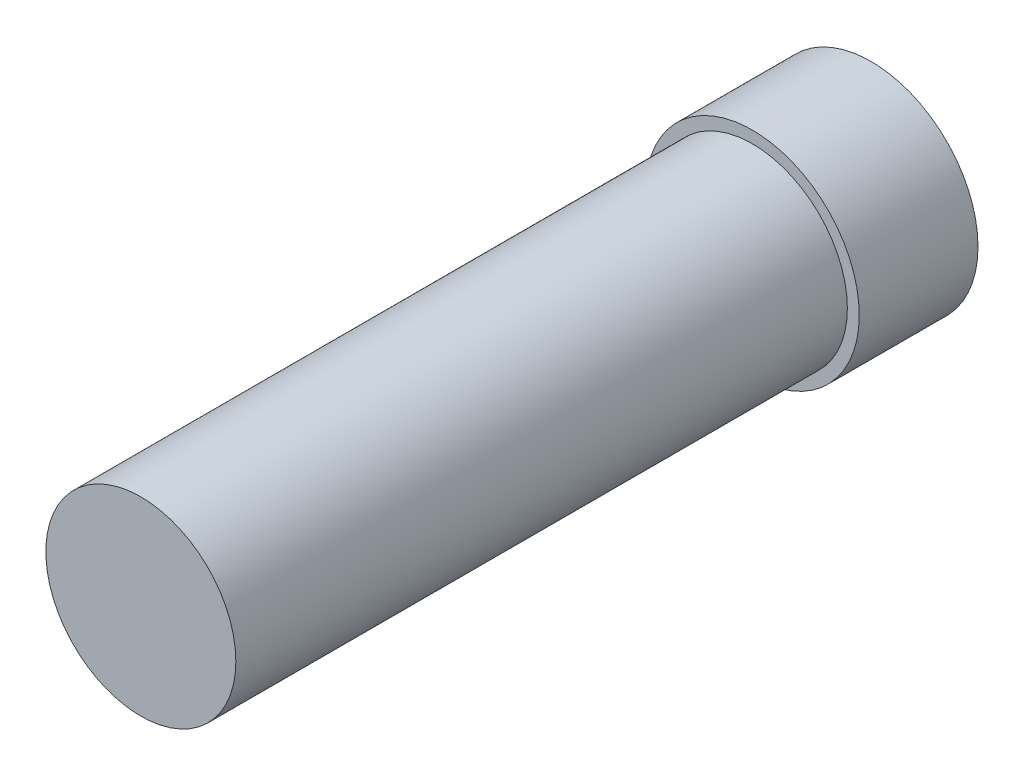
ISO-10303-21;
HEADER;
FILE_DESCRIPTION(('STEP AP214'),'2;1');
FILE_NAME('part.step','',(''),(''),'','','');
FILE_SCHEMA(('AUTOMOTIVE_DESIGN { 1 0 10303 214 1 1 1 1 }'));
ENDSEC;
DATA;
#1=APPLICATION_CONTEXT('core data for automotive mechanical design processes');
#2=APPLICATION_PROTOCOL_DEFINITION('international standard','automotive_design',2000,#1);
#3=PRODUCT_CONTEXT('',#1,'mechanical');
#4=PRODUCT('Part','Part','',(#3));
#5=PRODUCT_RELATED_PRODUCT_CATEGORY('part','',(#4));
#6=PRODUCT_DEFINITION_FORMATION('','',#4);
#7=PRODUCT_DEFINITION_CONTEXT('part definition',#1,'design');
#8=PRODUCT_DEFINITION('design','',#6,#7);
#9=PRODUCT_DEFINITION_SHAPE('','',#8);
#10=(LENGTH_UNIT() NAMED_UNIT(*) SI_UNIT(.MILLI.,.METRE.));
#11=(NAMED_UNIT(*) PLANE_ANGLE_UNIT() SI_UNIT($,.RADIAN.));
#12=(NAMED_UNIT(*) SI_UNIT($,.STERADIAN.) SOLID_ANGLE_UNIT());
#13=UNCERTAINTY_MEASURE_WITH_UNIT(LENGTH_MEASURE(1.E-05),#10,'distance_accuracy_value','');
#14=(GEOMETRIC_REPRESENTATION_CONTEXT(3) GLOBAL_UNCERTAINTY_ASSIGNED_CONTEXT((#13)) GLOBAL_UNIT_ASSIGNED_CONTEXT((#10,
#11,#12)) REPRESENTATION_CONTEXT('',''));
#15=CARTESIAN_POINT('',(0.,0.,0.));
#16=DIRECTION('',(0.,0.,1.));
#17=DIRECTION('',(1.,0.,0.));
#18=AXIS2_PLACEMENT_3D('',#15,#16,#17);
#19=CARTESIAN_POINT('',(0.,0.,13.08));
#20=DIRECTION('',(0.,0.,-1.));
#21=DIRECTION('',(-1.,0.,0.));
#22=AXIS2_PLACEMENT_3D('',#19,#20,#21);
#23=CYLINDRICAL_SURFACE('',#22,2.032);
#24=CARTESIAN_POINT('',(0.,0.,13.08));
#25=DIRECTION('',(0.,0.,1.));
#26=DIRECTION('',(1.,0.,0.));
#27=AXIS2_PLACEMENT_3D('',#24,#25,#26);
#28=CIRCLE('',#27,2.032);
#29=CARTESIAN_POINT('',(2.032,0.,13.08));
#30=VERTEX_POINT('',#29);
#31=EDGE_CURVE('E11',#30,#30,#28,.T.);
#32=ORIENTED_EDGE('',*,*,#31,.F.);
#33=EDGE_LOOP('',(#32));
#34=FACE_BOUND('',#33,.T.);
#35=CARTESIAN_POINT('',(0.,0.,0.));
#36=DIRECTION('',(0.,0.,1.));
#37=DIRECTION('',(1.,0.,0.));
#38=AXIS2_PLACEMENT_3D('',#35,#36,#37);
#39=CIRCLE('',#38,2.032);
#40=CARTESIAN_POINT('',(2.032,0.,0.));
#41=VERTEX_POINT('',#40);
#42=EDGE_CURVE('E38',#41,#41,#39,.T.);
#43=ORIENTED_EDGE('',*,*,#42,.T.);
#44=EDGE_LOOP('',(#43));
#45=FACE_BOUND('',#44,.T.);
#46=ADVANCED_FACE('F35',(#34,#45),#23,.T.);
#47=CARTESIAN_POINT('',(0.,0.,13.08));
#48=DIRECTION('',(0.,0.,1.));
#49=DIRECTION('',(1.,0.,0.));
#50=AXIS2_PLACEMENT_3D('',#47,#48,#49);
#51=PLANE('',#50);
#52=ORIENTED_EDGE('',*,*,#31,.T.);
#53=EDGE_LOOP('',(#52));
#54=FACE_BOUND('',#53,.T.);
#55=ADVANCED_FACE('F167',(#54),#51,.T.);
#56=CARTESIAN_POINT('',(0.,0.,-2.54));
#57=DIRECTION('',(0.,0.,1.));
#58=DIRECTION('',(1.,0.,0.));
#59=AXIS2_PLACEMENT_3D('',#56,#57,#58);
#60=CYLINDRICAL_SURFACE('',#59,2.286);
#61=CARTESIAN_POINT('',(0.,0.,-2.54));
#62=DIRECTION('',(0.,0.,-1.));
#63=DIRECTION('',(-1.,0.,0.));
#64=AXIS2_PLACEMENT_3D('',#61,#62,#63);
#65=CIRCLE('',#64,2.286);
#66=CARTESIAN_POINT('',(-2.286,0.,-2.54));
#67=VERTEX_POINT('',#66);
#68=EDGE_CURVE('E142',#67,#67,#65,.T.);
#69=ORIENTED_EDGE('',*,*,#68,.F.);
#70=EDGE_LOOP('',(#69));
#71=FACE_BOUND('',#70,.T.);
#72=CARTESIAN_POINT('',(0.,0.,0.));
#73=DIRECTION('',(0.,0.,-1.));
#74=DIRECTION('',(-1.,0.,0.));
#75=AXIS2_PLACEMENT_3D('',#72,#73,#74);
#76=CIRCLE('',#75,2.286);
#77=CARTESIAN_POINT('',(-2.286,0.,0.));
#78=VERTEX_POINT('',#77);
#79=EDGE_CURVE('E136',#78,#78,#76,.T.);
#80=ORIENTED_EDGE('',*,*,#79,.T.);
#81=EDGE_LOOP('',(#80));
#82=FACE_BOUND('',#81,.T.);
#83=ADVANCED_FACE('F148',(#71,#82),#60,.T.);
#84=CARTESIAN_POINT('',(0.,0.,-2.54));
#85=DIRECTION('',(0.,0.,-1.));
#86=DIRECTION('',(-1.,0.,0.));
#87=AXIS2_PLACEMENT_3D('',#84,#85,#86);
#88=PLANE('',#87);
#89=DIRECTION('',(-0.866025403784442,-0.499999999999995,0.));
#90=VECTOR('',#89,1.);
#91=CARTESIAN_POINT('',(1.34644615190706,-0.777371048252901,-2.54));
#92=LINE('',#91,#90);
#93=CARTESIAN_POINT('',(1.34644615190706,-0.777371048252901,-2.54));
#94=VERTEX_POINT('',#93);
#95=CARTESIAN_POINT('',(0.,-1.55474209650577,-2.54));
#96=VERTEX_POINT('',#95);
#97=EDGE_CURVE('E49',#94,#96,#92,.T.);
#98=ORIENTED_EDGE('',*,*,#97,.F.);
#99=DIRECTION('',(0.,-1.,0.));
#100=VECTOR('',#99,1.);
#101=CARTESIAN_POINT('',(1.34644615190708,0.777371048252872,-2.54));
#102=LINE('',#101,#100);
#103=CARTESIAN_POINT('',(1.34644615190708,0.777371048252872,-2.54));
#104=VERTEX_POINT('',#103);
#105=EDGE_CURVE('E132',#104,#94,#102,.T.);
#106=ORIENTED_EDGE('',*,*,#105,.F.);
#107=DIRECTION('',(0.866025403784435,-0.500000000000007,0.));
#108=VECTOR('',#107,1.);
#109=CARTESIAN_POINT('',(0.,1.55474209650577,-2.54));
#110=LINE('',#109,#108);
#111=CARTESIAN_POINT('',(0.,1.55474209650577,-2.54));
#112=VERTEX_POINT('',#111);
#113=EDGE_CURVE('E130',#112,#104,#110,.T.);
#114=ORIENTED_EDGE('',*,*,#113,.F.);
#115=DIRECTION('',(0.866025403784441,0.499999999999995,0.));
#116=VECTOR('',#115,1.);
#117=CARTESIAN_POINT('',(-1.34644615190707,0.777371048252891,-2.54));
#118=LINE('',#117,#116);
#119=CARTESIAN_POINT('',(-1.34644615190707,0.777371048252891,-2.54));
#120=VERTEX_POINT('',#119);
#121=EDGE_CURVE('E97',#120,#112,#118,.T.);
#122=ORIENTED_EDGE('',*,*,#121,.F.);
#123=DIRECTION('',(0.,1.,0.));
#124=VECTOR('',#123,1.);
#125=CARTESIAN_POINT('',(-1.34644615190708,-0.777371048252882,-2.54));
#126=LINE('',#125,#124);
#127=CARTESIAN_POINT('',(-1.34644615190708,-0.777371048252882,-2.54));
#128=VERTEX_POINT('',#127);
#129=EDGE_CURVE('E126',#128,#120,#126,.T.);
#130=ORIENTED_EDGE('',*,*,#129,.F.);
#131=DIRECTION('',(-0.866025403784438,0.500000000000001,0.));
#132=VECTOR('',#131,1.);
#133=CARTESIAN_POINT('',(0.,-1.55474209650577,-2.54));
#134=LINE('',#133,#132);
#135=EDGE_CURVE('E123',#96,#128,#134,.T.);
#136=ORIENTED_EDGE('',*,*,#135,.F.);
#137=EDGE_LOOP('',(#98,#106,#114,#122,#130,#136));
#138=FACE_BOUND('',#137,.T.);
#139=ORIENTED_EDGE('',*,*,#68,.T.);
#140=EDGE_LOOP('',(#139));
#141=FACE_BOUND('',#140,.T.);
#142=ADVANCED_FACE('F153',(#138,#141),#88,.T.);
#143=CARTESIAN_POINT('',(0.,0.,0.));
#144=DIRECTION('',(0.,0.,-1.));
#145=DIRECTION('',(-1.,0.,0.));
#146=AXIS2_PLACEMENT_3D('',#143,#144,#145);
#147=PLANE('',#146);
#148=ORIENTED_EDGE('',*,*,#42,.F.);
#149=EDGE_LOOP('',(#148));
#150=FACE_BOUND('',#149,.T.);
#151=ORIENTED_EDGE('',*,*,#79,.F.);
#152=EDGE_LOOP('',(#151));
#153=FACE_BOUND('',#152,.T.);
#154=ADVANCED_FACE('F150',(#150,#153),#147,.F.);
#155=CARTESIAN_POINT('',(1.34644615190706,-0.777371048252901,-0.508));
#156=DIRECTION('',(0.499999999999995,-0.866025403784442,0.));
#157=DIRECTION('',(0.866025403784442,0.499999999999995,0.));
#158=AXIS2_PLACEMENT_3D('',#155,#156,#157);
#159=PLANE('',#158);
#160=ORIENTED_EDGE('',*,*,#97,.T.);
#161=DIRECTION('',(0.,0.,-1.));
#162=VECTOR('',#161,1.);
#163=CARTESIAN_POINT('',(0.,-1.55474209650577,-0.508));
#164=LINE('',#163,#162);
#165=CARTESIAN_POINT('',(0.,-1.55474209650577,-0.508));
#166=VERTEX_POINT('',#165);
#167=EDGE_CURVE('E79',#166,#96,#164,.T.);
#168=ORIENTED_EDGE('',*,*,#167,.F.);
#169=DIRECTION('',(-0.866025403784442,-0.499999999999995,0.));
#170=VECTOR('',#169,1.);
#171=CARTESIAN_POINT('',(1.34644615190706,-0.777371048252901,-0.508));
#172=LINE('',#171,#170);
#173=CARTESIAN_POINT('',(1.34644615190706,-0.777371048252901,-0.508));
#174=VERTEX_POINT('',#173);
#175=EDGE_CURVE('E134',#174,#166,#172,.T.);
#176=ORIENTED_EDGE('',*,*,#175,.F.);
#177=DIRECTION('',(0.,0.,-1.));
#178=VECTOR('',#177,1.);
#179=CARTESIAN_POINT('',(1.34644615190706,-0.777371048252901,-0.508));
#180=LINE('',#179,#178);
#181=EDGE_CURVE('E57',#174,#94,#180,.T.);
#182=ORIENTED_EDGE('',*,*,#181,.T.);
#183=EDGE_LOOP('',(#160,#168,#176,#182));
#184=FACE_BOUND('',#183,.T.);
#185=ADVANCED_FACE('F152',(#184),#159,.F.);
#186=CARTESIAN_POINT('',(1.34644615190708,0.777371048252872,-0.508));
#187=DIRECTION('',(1.,0.,0.));
#188=DIRECTION('',(0.,1.,0.));
#189=AXIS2_PLACEMENT_3D('',#186,#187,#188);
#190=PLANE('',#189);
#191=ORIENTED_EDGE('',*,*,#105,.T.);
#192=ORIENTED_EDGE('',*,*,#181,.F.);
#193=DIRECTION('',(0.,-1.,0.));
#194=VECTOR('',#193,1.);
#195=CARTESIAN_POINT('',(1.34644615190708,0.777371048252872,-0.508));
#196=LINE('',#195,#194);
#197=CARTESIAN_POINT('',(1.34644615190708,0.777371048252872,-0.508));
#198=VERTEX_POINT('',#197);
#199=EDGE_CURVE('E109',#198,#174,#196,.T.);
#200=ORIENTED_EDGE('',*,*,#199,.F.);
#201=DIRECTION('',(0.,0.,-1.));
#202=VECTOR('',#201,1.);
#203=CARTESIAN_POINT('',(1.34644615190708,0.777371048252872,-0.508));
#204=LINE('',#203,#202);
#205=EDGE_CURVE('E101',#198,#104,#204,.T.);
#206=ORIENTED_EDGE('',*,*,#205,.T.);
#207=EDGE_LOOP('',(#191,#192,#200,#206));
#208=FACE_BOUND('',#207,.T.);
#209=ADVANCED_FACE('F160',(#208),#190,.F.);
#210=CARTESIAN_POINT('',(0.,1.55474209650577,-0.508));
#211=DIRECTION('',(0.500000000000007,0.866025403784435,0.));
#212=DIRECTION('',(-0.866025403784435,0.500000000000007,0.));
#213=AXIS2_PLACEMENT_3D('',#210,#211,#212);
#214=PLANE('',#213);
#215=ORIENTED_EDGE('',*,*,#113,.T.);
#216=ORIENTED_EDGE('',*,*,#205,.F.);
#217=DIRECTION('',(0.866025403784435,-0.500000000000007,0.));
#218=VECTOR('',#217,1.);
#219=CARTESIAN_POINT('',(0.,1.55474209650577,-0.508));
#220=LINE('',#219,#218);
#221=CARTESIAN_POINT('',(0.,1.55474209650577,-0.508));
#222=VERTEX_POINT('',#221);
#223=EDGE_CURVE('E105',#222,#198,#220,.T.);
#224=ORIENTED_EDGE('',*,*,#223,.F.);
#225=DIRECTION('',(0.,0.,-1.));
#226=VECTOR('',#225,1.);
#227=CARTESIAN_POINT('',(0.,1.55474209650577,-0.508));
#228=LINE('',#227,#226);
#229=EDGE_CURVE('E90',#222,#112,#228,.T.);
#230=ORIENTED_EDGE('',*,*,#229,.T.);
#231=EDGE_LOOP('',(#215,#216,#224,#230));
#232=FACE_BOUND('',#231,.T.);
#233=ADVANCED_FACE('F106',(#232),#214,.F.);
#234=CARTESIAN_POINT('',(-1.34644615190707,0.777371048252891,-0.508));
#235=DIRECTION('',(-0.499999999999995,0.866025403784441,0.));
#236=DIRECTION('',(-0.866025403784442,-0.499999999999995,0.));
#237=AXIS2_PLACEMENT_3D('',#234,#235,#236);
#238=PLANE('',#237);
#239=ORIENTED_EDGE('',*,*,#121,.T.);
#240=ORIENTED_EDGE('',*,*,#229,.F.);
#241=DIRECTION('',(0.866025403784441,0.499999999999995,0.));
#242=VECTOR('',#241,1.);
#243=CARTESIAN_POINT('',(-1.34644615190707,0.777371048252891,-0.508));
#244=LINE('',#243,#242);
#245=CARTESIAN_POINT('',(-1.34644615190707,0.777371048252891,-0.508));
#246=VERTEX_POINT('',#245);
#247=EDGE_CURVE('E94',#246,#222,#244,.T.);
#248=ORIENTED_EDGE('',*,*,#247,.F.);
#249=DIRECTION('',(0.,0.,-1.));
#250=VECTOR('',#249,1.);
#251=CARTESIAN_POINT('',(-1.34644615190707,0.777371048252891,-0.508));
#252=LINE('',#251,#250);
#253=EDGE_CURVE('E102',#246,#120,#252,.T.);
#254=ORIENTED_EDGE('',*,*,#253,.T.);
#255=EDGE_LOOP('',(#239,#240,#248,#254));
#256=FACE_BOUND('',#255,.T.);
#257=ADVANCED_FACE('F92',(#256),#238,.F.);
#258=CARTESIAN_POINT('',(-1.34644615190708,-0.777371048252882,-0.508));
#259=DIRECTION('',(-1.,0.,0.));
#260=DIRECTION('',(0.,-1.,0.));
#261=AXIS2_PLACEMENT_3D('',#258,#259,#260);
#262=PLANE('',#261);
#263=ORIENTED_EDGE('',*,*,#129,.T.);
#264=ORIENTED_EDGE('',*,*,#253,.F.);
#265=DIRECTION('',(0.,1.,0.));
#266=VECTOR('',#265,1.);
#267=CARTESIAN_POINT('',(-1.34644615190708,-0.777371048252882,-0.508));
#268=LINE('',#267,#266);
#269=CARTESIAN_POINT('',(-1.34644615190708,-0.777371048252882,-0.508));
#270=VERTEX_POINT('',#269);
#271=EDGE_CURVE('E115',#270,#246,#268,.T.);
#272=ORIENTED_EDGE('',*,*,#271,.F.);
#273=DIRECTION('',(0.,0.,-1.));
#274=VECTOR('',#273,1.);
#275=CARTESIAN_POINT('',(-1.34644615190708,-0.777371048252882,-0.508));
#276=LINE('',#275,#274);
#277=EDGE_CURVE('E139',#270,#128,#276,.T.);
#278=ORIENTED_EDGE('',*,*,#277,.T.);
#279=EDGE_LOOP('',(#263,#264,#272,#278));
#280=FACE_BOUND('',#279,.T.);
#281=ADVANCED_FACE('F221',(#280),#262,.F.);
#282=CARTESIAN_POINT('',(0.,-1.55474209650577,-0.508));
#283=DIRECTION('',(-0.500000000000001,-0.866025403784438,0.));
#284=DIRECTION('',(0.866025403784438,-0.500000000000001,0.));
#285=AXIS2_PLACEMENT_3D('',#282,#283,#284);
#286=PLANE('',#285);
#287=ORIENTED_EDGE('',*,*,#135,.T.);
#288=ORIENTED_EDGE('',*,*,#277,.F.);
#289=DIRECTION('',(-0.866025403784438,0.500000000000001,0.));
#290=VECTOR('',#289,1.);
#291=CARTESIAN_POINT('',(0.,-1.55474209650577,-0.508));
#292=LINE('',#291,#290);
#293=EDGE_CURVE('E117',#166,#270,#292,.T.);
#294=ORIENTED_EDGE('',*,*,#293,.F.);
#295=ORIENTED_EDGE('',*,*,#167,.T.);
#296=EDGE_LOOP('',(#287,#288,#294,#295));
#297=FACE_BOUND('',#296,.T.);
#298=ADVANCED_FACE('F230',(#297),#286,.F.);
#299=CARTESIAN_POINT('',(0.,0.,-0.508));
#300=DIRECTION('',(0.,0.,-1.));
#301=DIRECTION('',(-1.,0.,0.));
#302=AXIS2_PLACEMENT_3D('',#299,#300,#301);
#303=PLANE('',#302);
#304=ORIENTED_EDGE('',*,*,#175,.T.);
#305=ORIENTED_EDGE('',*,*,#293,.T.);
#306=ORIENTED_EDGE('',*,*,#271,.T.);
#307=ORIENTED_EDGE('',*,*,#247,.T.);
#308=ORIENTED_EDGE('',*,*,#223,.T.);
#309=ORIENTED_EDGE('',*,*,#199,.T.);
#310=EDGE_LOOP('',(#304,#305,#306,#307,#308,#309));
#311=FACE_BOUND('',#310,.T.);
#312=ADVANCED_FACE('F112',(#311),#303,.T.);
#313=CLOSED_SHELL('',(#46,#55,#83,#142,#154,#185,#209,#233,#257,#281,#298,#312));
#314=MANIFOLD_SOLID_BREP('B2',#313);
#315=ADVANCED_BREP_SHAPE_REPRESENTATION('',(#18,#314),#14);
#316=SHAPE_DEFINITION_REPRESENTATION(#9,#315);
ENDSEC;
END-ISO-10303-21;
